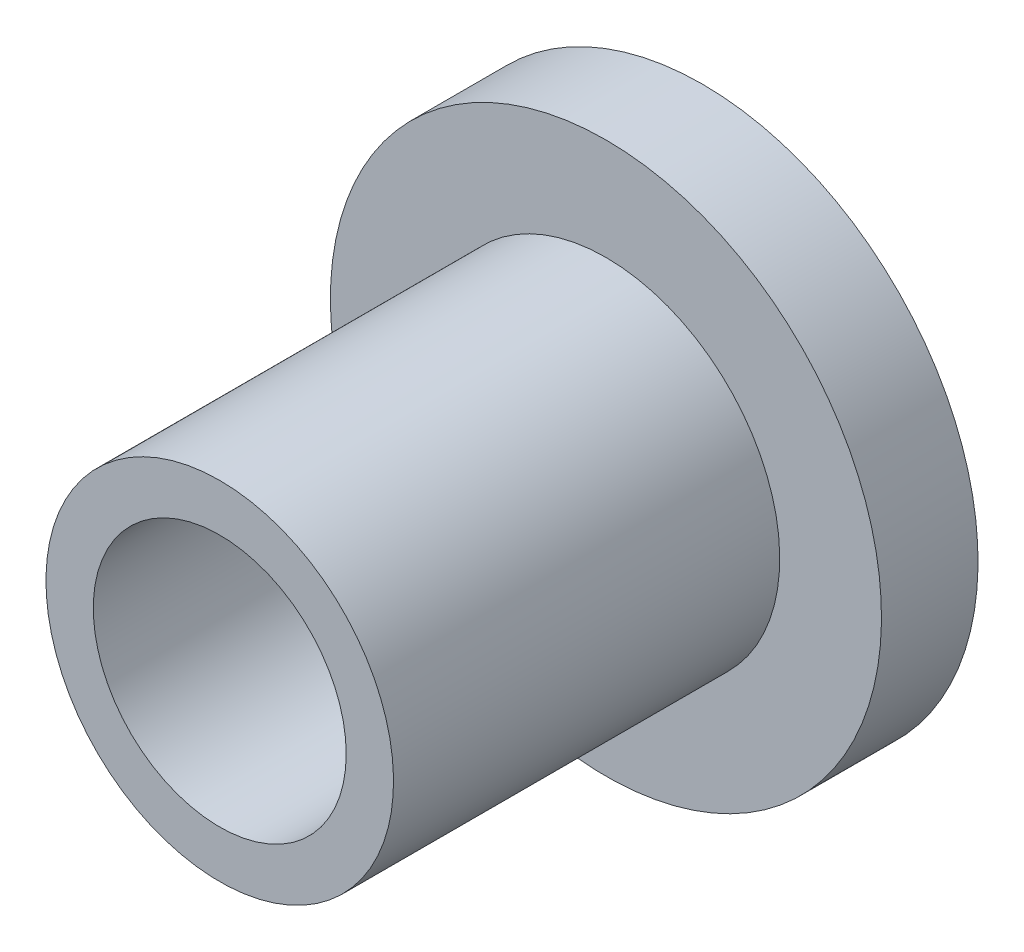
ISO-10303-21;
HEADER;
FILE_DESCRIPTION(('STEP AP214'),'2;1');
FILE_NAME('part.step','',(''),(''),'','','');
FILE_SCHEMA(('AUTOMOTIVE_DESIGN { 1 0 10303 214 1 1 1 1 }'));
ENDSEC;
DATA;
#1=APPLICATION_CONTEXT('core data for automotive mechanical design processes');
#2=APPLICATION_PROTOCOL_DEFINITION('international standard','automotive_design',2000,#1);
#3=PRODUCT_CONTEXT('',#1,'mechanical');
#4=PRODUCT('Part','Part','',(#3));
#5=PRODUCT_RELATED_PRODUCT_CATEGORY('part','',(#4));
#6=PRODUCT_DEFINITION_FORMATION('','',#4);
#7=PRODUCT_DEFINITION_CONTEXT('part definition',#1,'design');
#8=PRODUCT_DEFINITION('design','',#6,#7);
#9=PRODUCT_DEFINITION_SHAPE('','',#8);
#10=(LENGTH_UNIT() NAMED_UNIT(*) SI_UNIT(.MILLI.,.METRE.));
#11=(NAMED_UNIT(*) PLANE_ANGLE_UNIT() SI_UNIT($,.RADIAN.));
#12=(NAMED_UNIT(*) SI_UNIT($,.STERADIAN.) SOLID_ANGLE_UNIT());
#13=UNCERTAINTY_MEASURE_WITH_UNIT(LENGTH_MEASURE(1.E-05),#10,'distance_accuracy_value','');
#14=(GEOMETRIC_REPRESENTATION_CONTEXT(3) GLOBAL_UNCERTAINTY_ASSIGNED_CONTEXT((#13)) GLOBAL_UNIT_ASSIGNED_CONTEXT((#10,
#11,#12)) REPRESENTATION_CONTEXT('',''));
#15=CARTESIAN_POINT('',(0.,0.,0.));
#16=DIRECTION('',(0.,0.,1.));
#17=DIRECTION('',(1.,0.,0.));
#18=AXIS2_PLACEMENT_3D('',#15,#16,#17);
#19=CARTESIAN_POINT('',(588.451811662626,952.777089149425,1404.44325353184));
#20=DIRECTION('',(0.,0.,-1.));
#21=DIRECTION('',(0.,1.,0.));
#22=AXIS2_PLACEMENT_3D('',#19,#20,#21);
#23=CYLINDRICAL_SURFACE('',#22,8.99999999828971);
#24=CARTESIAN_POINT('',(588.451811662626,952.777089149425,1404.44325353184));
#25=DIRECTION('',(0.,0.,-1.));
#26=DIRECTION('',(0.,1.,0.));
#27=AXIS2_PLACEMENT_3D('',#24,#25,#26);
#28=CIRCLE('',#27,8.99999999828971);
#29=CARTESIAN_POINT('',(588.451811662626,961.777089147714,1404.44325353184));
#30=VERTEX_POINT('',#29);
#31=EDGE_CURVE('E10',#30,#30,#28,.T.);
#32=ORIENTED_EDGE('',*,*,#31,.T.);
#33=EDGE_LOOP('',(#32));
#34=FACE_BOUND('',#33,.T.);
#35=CARTESIAN_POINT('',(588.451811662625,952.777089149425,1384.44325353184));
#36=DIRECTION('',(0.,0.,-1.));
#37=DIRECTION('',(0.,1.,0.));
#38=AXIS2_PLACEMENT_3D('',#35,#36,#37);
#39=CIRCLE('',#38,8.99999999828971);
#40=CARTESIAN_POINT('',(588.451811662625,961.777089147715,1384.44325353184));
#41=VERTEX_POINT('',#40);
#42=EDGE_CURVE('E46',#41,#41,#39,.T.);
#43=ORIENTED_EDGE('',*,*,#42,.F.);
#44=EDGE_LOOP('',(#43));
#45=FACE_BOUND('',#44,.T.);
#46=ADVANCED_FACE('F43',(#34,#45),#23,.T.);
#47=CARTESIAN_POINT('',(588.451811662626,952.777089149425,1404.44325353184));
#48=DIRECTION('',(0.,0.,-1.));
#49=DIRECTION('',(0.,1.,0.));
#50=AXIS2_PLACEMENT_3D('',#47,#48,#49);
#51=PLANE('',#50);
#52=CARTESIAN_POINT('',(588.451811662626,952.777089149425,1404.44325353183));
#53=DIRECTION('',(0.,0.,1.));
#54=DIRECTION('',(1.,0.,0.));
#55=AXIS2_PLACEMENT_3D('',#52,#53,#54);
#56=CIRCLE('',#55,6.54966241213339);
#57=CARTESIAN_POINT('',(595.001474074759,952.777089149425,1404.44325353183));
#58=VERTEX_POINT('',#57);
#59=EDGE_CURVE('E61',#58,#58,#56,.T.);
#60=ORIENTED_EDGE('',*,*,#59,.F.);
#61=EDGE_LOOP('',(#60));
#62=FACE_BOUND('',#61,.T.);
#63=ORIENTED_EDGE('',*,*,#31,.F.);
#64=EDGE_LOOP('',(#63));
#65=FACE_BOUND('',#64,.T.);
#66=ADVANCED_FACE('F76',(#62,#65),#51,.F.);
#67=CARTESIAN_POINT('',(588.451811662625,952.777089149425,1379.44325353184));
#68=DIRECTION('',(0.,0.,1.));
#69=DIRECTION('',(0.,-1.,0.));
#70=AXIS2_PLACEMENT_3D('',#67,#68,#69);
#71=CYLINDRICAL_SURFACE('',#70,14.2703278737126);
#72=CARTESIAN_POINT('',(588.451811662625,952.777089149425,1379.44325353184));
#73=DIRECTION('',(0.,0.,-1.));
#74=DIRECTION('',(0.,1.,0.));
#75=AXIS2_PLACEMENT_3D('',#72,#73,#74);
#76=CIRCLE('',#75,14.2703278737126);
#77=CARTESIAN_POINT('',(588.451811662625,967.047417023138,1379.44325353184));
#78=VERTEX_POINT('',#77);
#79=EDGE_CURVE('E53',#78,#78,#76,.T.);
#80=ORIENTED_EDGE('',*,*,#79,.F.);
#81=EDGE_LOOP('',(#80));
#82=FACE_BOUND('',#81,.T.);
#83=CARTESIAN_POINT('',(588.451811662625,952.777089149425,1384.44325353184));
#84=DIRECTION('',(0.,0.,-1.));
#85=DIRECTION('',(0.,1.,0.));
#86=AXIS2_PLACEMENT_3D('',#83,#84,#85);
#87=CIRCLE('',#86,14.2703278737126);
#88=CARTESIAN_POINT('',(588.451811662625,967.047417023138,1384.44325353184));
#89=VERTEX_POINT('',#88);
#90=EDGE_CURVE('E55',#89,#89,#87,.T.);
#91=ORIENTED_EDGE('',*,*,#90,.T.);
#92=EDGE_LOOP('',(#91));
#93=FACE_BOUND('',#92,.T.);
#94=ADVANCED_FACE('F79',(#82,#93),#71,.T.);
#95=CARTESIAN_POINT('',(588.451811662625,952.777089149425,1379.44325353184));
#96=DIRECTION('',(0.,0.,-1.));
#97=DIRECTION('',(0.,1.,0.));
#98=AXIS2_PLACEMENT_3D('',#95,#96,#97);
#99=PLANE('',#98);
#100=ORIENTED_EDGE('',*,*,#79,.T.);
#101=EDGE_LOOP('',(#100));
#102=FACE_BOUND('',#101,.T.);
#103=ADVANCED_FACE('F85',(#102),#99,.T.);
#104=CARTESIAN_POINT('',(588.451811662625,952.777089149425,1384.44325353184));
#105=DIRECTION('',(0.,0.,-1.));
#106=DIRECTION('',(0.,1.,0.));
#107=AXIS2_PLACEMENT_3D('',#104,#105,#106);
#108=PLANE('',#107);
#109=ORIENTED_EDGE('',*,*,#42,.T.);
#110=EDGE_LOOP('',(#109));
#111=FACE_BOUND('',#110,.T.);
#112=ORIENTED_EDGE('',*,*,#90,.F.);
#113=EDGE_LOOP('',(#112));
#114=FACE_BOUND('',#113,.T.);
#115=ADVANCED_FACE('F72',(#111,#114),#108,.F.);
#116=CARTESIAN_POINT('',(588.451811662626,952.777089149425,1386.44325353183));
#117=DIRECTION('',(0.,0.,1.));
#118=DIRECTION('',(1.,0.,0.));
#119=AXIS2_PLACEMENT_3D('',#116,#117,#118);
#120=CYLINDRICAL_SURFACE('',#119,6.54966241213339);
#121=CARTESIAN_POINT('',(588.451811662626,952.777089149425,1386.44325353183));
#122=DIRECTION('',(0.,0.,1.));
#123=DIRECTION('',(1.,0.,0.));
#124=AXIS2_PLACEMENT_3D('',#121,#122,#123);
#125=CIRCLE('',#124,6.54966241213339);
#126=CARTESIAN_POINT('',(595.001474074759,952.777089149425,1386.44325353183));
#127=VERTEX_POINT('',#126);
#128=EDGE_CURVE('E58',#127,#127,#125,.T.);
#129=ORIENTED_EDGE('',*,*,#128,.F.);
#130=EDGE_LOOP('',(#129));
#131=FACE_BOUND('',#130,.T.);
#132=ORIENTED_EDGE('',*,*,#59,.T.);
#133=EDGE_LOOP('',(#132));
#134=FACE_BOUND('',#133,.T.);
#135=ADVANCED_FACE('F69',(#131,#134),#120,.F.);
#136=CARTESIAN_POINT('',(588.451811662626,952.777089149425,1386.44325353183));
#137=DIRECTION('',(0.,0.,1.));
#138=DIRECTION('',(1.,0.,0.));
#139=AXIS2_PLACEMENT_3D('',#136,#137,#138);
#140=PLANE('',#139);
#141=ORIENTED_EDGE('',*,*,#128,.T.);
#142=EDGE_LOOP('',(#141));
#143=FACE_BOUND('',#142,.T.);
#144=ADVANCED_FACE('F67',(#143),#140,.T.);
#145=CLOSED_SHELL('',(#46,#66,#94,#103,#115,#135,#144));
#146=MANIFOLD_SOLID_BREP('B2',#145);
#147=ADVANCED_BREP_SHAPE_REPRESENTATION('',(#18,#146),#14);
#148=SHAPE_DEFINITION_REPRESENTATION(#9,#147);
ENDSEC;
END-ISO-10303-21;
